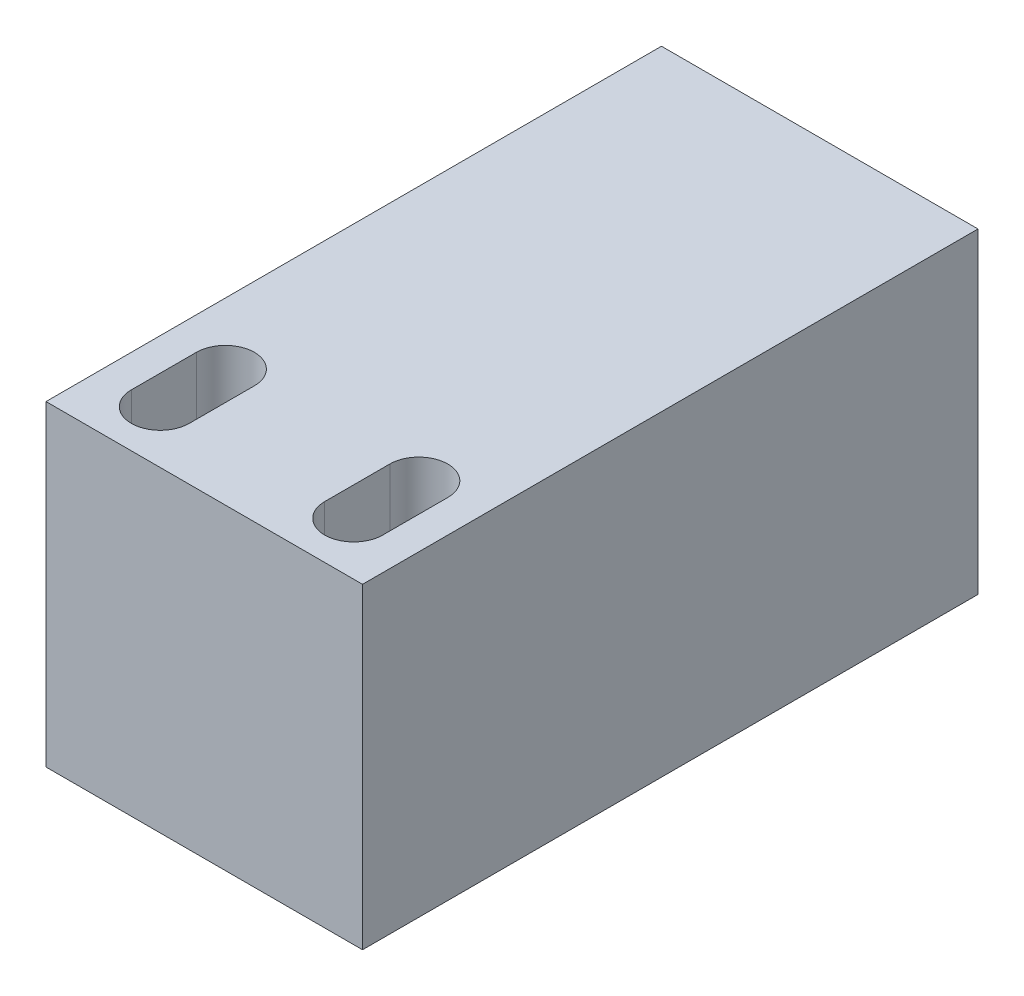
ISO-10303-21;
HEADER;
FILE_DESCRIPTION(('STEP AP214'),'2;1');
FILE_NAME('part.step','',(''),(''),'','','');
FILE_SCHEMA(('AUTOMOTIVE_DESIGN { 1 0 10303 214 1 1 1 1 }'));
ENDSEC;
DATA;
#1=APPLICATION_CONTEXT('core data for automotive mechanical design processes');
#2=APPLICATION_PROTOCOL_DEFINITION('international standard','automotive_design',2000,#1);
#3=PRODUCT_CONTEXT('',#1,'mechanical');
#4=PRODUCT('Part','Part','',(#3));
#5=PRODUCT_RELATED_PRODUCT_CATEGORY('part','',(#4));
#6=PRODUCT_DEFINITION_FORMATION('','',#4);
#7=PRODUCT_DEFINITION_CONTEXT('part definition',#1,'design');
#8=PRODUCT_DEFINITION('design','',#6,#7);
#9=PRODUCT_DEFINITION_SHAPE('','',#8);
#10=(LENGTH_UNIT() NAMED_UNIT(*) SI_UNIT(.MILLI.,.METRE.));
#11=(NAMED_UNIT(*) PLANE_ANGLE_UNIT() SI_UNIT($,.RADIAN.));
#12=(NAMED_UNIT(*) SI_UNIT($,.STERADIAN.) SOLID_ANGLE_UNIT());
#13=UNCERTAINTY_MEASURE_WITH_UNIT(LENGTH_MEASURE(1.E-05),#10,'distance_accuracy_value','');
#14=(GEOMETRIC_REPRESENTATION_CONTEXT(3) GLOBAL_UNCERTAINTY_ASSIGNED_CONTEXT((#13)) GLOBAL_UNIT_ASSIGNED_CONTEXT((#10,
#11,#12)) REPRESENTATION_CONTEXT('',''));
#15=CARTESIAN_POINT('',(0.,0.,0.));
#16=DIRECTION('',(0.,0.,1.));
#17=DIRECTION('',(1.,0.,0.));
#18=AXIS2_PLACEMENT_3D('',#15,#16,#17);
#19=CARTESIAN_POINT('',(9.,9.,35.));
#20=DIRECTION('',(-1.,0.,0.));
#21=DIRECTION('',(0.,0.,1.));
#22=AXIS2_PLACEMENT_3D('',#19,#20,#21);
#23=PLANE('',#22);
#24=DIRECTION('',(0.,1.,0.));
#25=VECTOR('',#24,1.);
#26=CARTESIAN_POINT('',(9.,9.,0.));
#27=LINE('',#26,#25);
#28=CARTESIAN_POINT('',(9.,-9.,0.));
#29=VERTEX_POINT('',#28);
#30=CARTESIAN_POINT('',(9.,9.,0.));
#31=VERTEX_POINT('',#30);
#32=EDGE_CURVE('E162',#29,#31,#27,.T.);
#33=ORIENTED_EDGE('',*,*,#32,.T.);
#34=DIRECTION('',(0.,0.,-1.));
#35=VECTOR('',#34,1.);
#36=CARTESIAN_POINT('',(9.,9.,35.));
#37=LINE('',#36,#35);
#38=CARTESIAN_POINT('',(9.,9.,35.));
#39=VERTEX_POINT('',#38);
#40=EDGE_CURVE('E195',#39,#31,#37,.T.);
#41=ORIENTED_EDGE('',*,*,#40,.F.);
#42=DIRECTION('',(0.,1.,0.));
#43=VECTOR('',#42,1.);
#44=CARTESIAN_POINT('',(9.,9.,35.));
#45=LINE('',#44,#43);
#46=CARTESIAN_POINT('',(9.,-9.,35.));
#47=VERTEX_POINT('',#46);
#48=EDGE_CURVE('E169',#47,#39,#45,.T.);
#49=ORIENTED_EDGE('',*,*,#48,.F.);
#50=DIRECTION('',(0.,0.,-1.));
#51=VECTOR('',#50,1.);
#52=CARTESIAN_POINT('',(9.,-9.,35.));
#53=LINE('',#52,#51);
#54=EDGE_CURVE('E179',#47,#29,#53,.T.);
#55=ORIENTED_EDGE('',*,*,#54,.T.);
#56=EDGE_LOOP('',(#33,#41,#49,#55));
#57=FACE_BOUND('',#56,.T.);
#58=ADVANCED_FACE('F32',(#57),#23,.F.);
#59=CARTESIAN_POINT('',(-9.,9.,35.));
#60=DIRECTION('',(0.,-1.,0.));
#61=DIRECTION('',(0.,0.,-1.));
#62=AXIS2_PLACEMENT_3D('',#59,#60,#61);
#63=PLANE('',#62);
#64=DIRECTION('',(0.,0.,-1.));
#65=VECTOR('',#64,1.);
#66=CARTESIAN_POINT('',(-3.85,9.,32.));
#67=LINE('',#66,#65);
#68=CARTESIAN_POINT('',(-3.85,9.,32.));
#69=VERTEX_POINT('',#68);
#70=CARTESIAN_POINT('',(-3.85,9.,28.3));
#71=VERTEX_POINT('',#70);
#72=EDGE_CURVE('E132',#69,#71,#67,.T.);
#73=ORIENTED_EDGE('',*,*,#72,.F.);
#74=CARTESIAN_POINT('',(-5.5,9.,32.));
#75=DIRECTION('',(0.,1.,0.));
#76=DIRECTION('',(0.,0.,1.));
#77=AXIS2_PLACEMENT_3D('',#74,#75,#76);
#78=CIRCLE('',#77,1.65);
#79=CARTESIAN_POINT('',(-7.15,9.,32.));
#80=VERTEX_POINT('',#79);
#81=EDGE_CURVE('E46',#80,#69,#78,.T.);
#82=ORIENTED_EDGE('',*,*,#81,.F.);
#83=DIRECTION('',(0.,0.,1.));
#84=VECTOR('',#83,1.);
#85=CARTESIAN_POINT('',(-7.15,9.,32.));
#86=LINE('',#85,#84);
#87=CARTESIAN_POINT('',(-7.15,9.,28.3));
#88=VERTEX_POINT('',#87);
#89=EDGE_CURVE('E139',#88,#80,#86,.T.);
#90=ORIENTED_EDGE('',*,*,#89,.F.);
#91=CARTESIAN_POINT('',(-5.5,9.,28.3));
#92=DIRECTION('',(0.,1.,0.));
#93=DIRECTION('',(0.,0.,1.));
#94=AXIS2_PLACEMENT_3D('',#91,#92,#93);
#95=CIRCLE('',#94,1.65);
#96=EDGE_CURVE('E123',#71,#88,#95,.T.);
#97=ORIENTED_EDGE('',*,*,#96,.F.);
#98=EDGE_LOOP('',(#73,#82,#90,#97));
#99=FACE_BOUND('',#98,.T.);
#100=DIRECTION('',(0.,0.,-1.));
#101=VECTOR('',#100,1.);
#102=CARTESIAN_POINT('',(7.15,9.,32.));
#103=LINE('',#102,#101);
#104=CARTESIAN_POINT('',(7.15,9.,32.));
#105=VERTEX_POINT('',#104);
#106=CARTESIAN_POINT('',(7.15,9.,28.3));
#107=VERTEX_POINT('',#106);
#108=EDGE_CURVE('E150',#105,#107,#103,.T.);
#109=ORIENTED_EDGE('',*,*,#108,.F.);
#110=CARTESIAN_POINT('',(5.5,9.,32.));
#111=DIRECTION('',(0.,1.,0.));
#112=DIRECTION('',(0.,0.,1.));
#113=AXIS2_PLACEMENT_3D('',#110,#111,#112);
#114=CIRCLE('',#113,1.65);
#115=CARTESIAN_POINT('',(3.85,9.,32.));
#116=VERTEX_POINT('',#115);
#117=EDGE_CURVE('E146',#116,#105,#114,.T.);
#118=ORIENTED_EDGE('',*,*,#117,.F.);
#119=DIRECTION('',(0.,0.,1.));
#120=VECTOR('',#119,1.);
#121=CARTESIAN_POINT('',(3.85,9.,32.));
#122=LINE('',#121,#120);
#123=CARTESIAN_POINT('',(3.85,9.,28.3));
#124=VERTEX_POINT('',#123);
#125=EDGE_CURVE('E156',#124,#116,#122,.T.);
#126=ORIENTED_EDGE('',*,*,#125,.F.);
#127=CARTESIAN_POINT('',(5.5,9.,28.3));
#128=DIRECTION('',(0.,1.,0.));
#129=DIRECTION('',(0.,0.,1.));
#130=AXIS2_PLACEMENT_3D('',#127,#128,#129);
#131=CIRCLE('',#130,1.65);
#132=EDGE_CURVE('E153',#107,#124,#131,.T.);
#133=ORIENTED_EDGE('',*,*,#132,.F.);
#134=EDGE_LOOP('',(#109,#118,#126,#133));
#135=FACE_BOUND('',#134,.T.);
#136=DIRECTION('',(-1.,0.,0.));
#137=VECTOR('',#136,1.);
#138=CARTESIAN_POINT('',(-9.,9.,0.));
#139=LINE('',#138,#137);
#140=CARTESIAN_POINT('',(-9.,9.,0.));
#141=VERTEX_POINT('',#140);
#142=EDGE_CURVE('E182',#31,#141,#139,.T.);
#143=ORIENTED_EDGE('',*,*,#142,.T.);
#144=DIRECTION('',(0.,0.,-1.));
#145=VECTOR('',#144,1.);
#146=CARTESIAN_POINT('',(-9.,9.,35.));
#147=LINE('',#146,#145);
#148=CARTESIAN_POINT('',(-9.,9.,35.));
#149=VERTEX_POINT('',#148);
#150=EDGE_CURVE('E192',#149,#141,#147,.T.);
#151=ORIENTED_EDGE('',*,*,#150,.F.);
#152=DIRECTION('',(-1.,0.,0.));
#153=VECTOR('',#152,1.);
#154=CARTESIAN_POINT('',(-9.,9.,35.));
#155=LINE('',#154,#153);
#156=EDGE_CURVE('E172',#39,#149,#155,.T.);
#157=ORIENTED_EDGE('',*,*,#156,.F.);
#158=ORIENTED_EDGE('',*,*,#40,.T.);
#159=EDGE_LOOP('',(#143,#151,#157,#158));
#160=FACE_BOUND('',#159,.T.);
#161=ADVANCED_FACE('F136',(#99,#135,#160),#63,.F.);
#162=CARTESIAN_POINT('',(-9.,9.,35.));
#163=DIRECTION('',(1.,0.,0.));
#164=DIRECTION('',(0.,0.,-1.));
#165=AXIS2_PLACEMENT_3D('',#162,#163,#164);
#166=PLANE('',#165);
#167=DIRECTION('',(0.,-1.,0.));
#168=VECTOR('',#167,1.);
#169=CARTESIAN_POINT('',(-9.,9.,0.));
#170=LINE('',#169,#168);
#171=CARTESIAN_POINT('',(-9.,-9.,0.));
#172=VERTEX_POINT('',#171);
#173=EDGE_CURVE('E184',#141,#172,#170,.T.);
#174=ORIENTED_EDGE('',*,*,#173,.T.);
#175=DIRECTION('',(0.,0.,-1.));
#176=VECTOR('',#175,1.);
#177=CARTESIAN_POINT('',(-9.,-9.,35.));
#178=LINE('',#177,#176);
#179=CARTESIAN_POINT('',(-9.,-9.,35.));
#180=VERTEX_POINT('',#179);
#181=EDGE_CURVE('E189',#180,#172,#178,.T.);
#182=ORIENTED_EDGE('',*,*,#181,.F.);
#183=DIRECTION('',(0.,-1.,0.));
#184=VECTOR('',#183,1.);
#185=CARTESIAN_POINT('',(-9.,9.,35.));
#186=LINE('',#185,#184);
#187=EDGE_CURVE('E175',#149,#180,#186,.T.);
#188=ORIENTED_EDGE('',*,*,#187,.F.);
#189=ORIENTED_EDGE('',*,*,#150,.T.);
#190=EDGE_LOOP('',(#174,#182,#188,#189));
#191=FACE_BOUND('',#190,.T.);
#192=ADVANCED_FACE('F238',(#191),#166,.F.);
#193=CARTESIAN_POINT('',(-9.,-9.,35.));
#194=DIRECTION('',(0.,1.,0.));
#195=DIRECTION('',(0.,0.,1.));
#196=AXIS2_PLACEMENT_3D('',#193,#194,#195);
#197=PLANE('',#196);
#198=DIRECTION('',(0.,0.,1.));
#199=VECTOR('',#198,1.);
#200=CARTESIAN_POINT('',(-7.15,-9.,35.));
#201=LINE('',#200,#199);
#202=CARTESIAN_POINT('',(-7.15,-9.,28.3));
#203=VERTEX_POINT('',#202);
#204=CARTESIAN_POINT('',(-7.15,-9.,32.));
#205=VERTEX_POINT('',#204);
#206=EDGE_CURVE('E39',#203,#205,#201,.T.);
#207=ORIENTED_EDGE('',*,*,#206,.T.);
#208=CARTESIAN_POINT('',(-5.5,-9.,32.));
#209=DIRECTION('',(0.,1.,0.));
#210=DIRECTION('',(0.,0.,1.));
#211=AXIS2_PLACEMENT_3D('',#208,#209,#210);
#212=CIRCLE('',#211,1.65);
#213=CARTESIAN_POINT('',(-3.85,-9.,32.));
#214=VERTEX_POINT('',#213);
#215=EDGE_CURVE('E11',#205,#214,#212,.T.);
#216=ORIENTED_EDGE('',*,*,#215,.T.);
#217=DIRECTION('',(0.,0.,-1.));
#218=VECTOR('',#217,1.);
#219=CARTESIAN_POINT('',(-3.85,-9.,35.));
#220=LINE('',#219,#218);
#221=CARTESIAN_POINT('',(-3.85,-9.,28.3));
#222=VERTEX_POINT('',#221);
#223=EDGE_CURVE('E210',#214,#222,#220,.T.);
#224=ORIENTED_EDGE('',*,*,#223,.T.);
#225=CARTESIAN_POINT('',(-5.5,-9.,28.3));
#226=DIRECTION('',(0.,1.,0.));
#227=DIRECTION('',(0.,0.,1.));
#228=AXIS2_PLACEMENT_3D('',#225,#226,#227);
#229=CIRCLE('',#228,1.65);
#230=EDGE_CURVE('E126',#222,#203,#229,.T.);
#231=ORIENTED_EDGE('',*,*,#230,.T.);
#232=EDGE_LOOP('',(#207,#216,#224,#231));
#233=FACE_BOUND('',#232,.T.);
#234=DIRECTION('',(0.,0.,1.));
#235=VECTOR('',#234,1.);
#236=CARTESIAN_POINT('',(3.85,-9.,35.));
#237=LINE('',#236,#235);
#238=CARTESIAN_POINT('',(3.85,-9.,28.3));
#239=VERTEX_POINT('',#238);
#240=CARTESIAN_POINT('',(3.85,-9.,32.));
#241=VERTEX_POINT('',#240);
#242=EDGE_CURVE('E204',#239,#241,#237,.T.);
#243=ORIENTED_EDGE('',*,*,#242,.T.);
#244=CARTESIAN_POINT('',(5.5,-9.,32.));
#245=DIRECTION('',(0.,1.,0.));
#246=DIRECTION('',(0.,0.,1.));
#247=AXIS2_PLACEMENT_3D('',#244,#245,#246);
#248=CIRCLE('',#247,1.65);
#249=CARTESIAN_POINT('',(7.15,-9.,32.));
#250=VERTEX_POINT('',#249);
#251=EDGE_CURVE('E207',#241,#250,#248,.T.);
#252=ORIENTED_EDGE('',*,*,#251,.T.);
#253=DIRECTION('',(0.,0.,-1.));
#254=VECTOR('',#253,1.);
#255=CARTESIAN_POINT('',(7.15,-9.,35.));
#256=LINE('',#255,#254);
#257=CARTESIAN_POINT('',(7.15,-9.,28.3));
#258=VERTEX_POINT('',#257);
#259=EDGE_CURVE('E198',#250,#258,#256,.T.);
#260=ORIENTED_EDGE('',*,*,#259,.T.);
#261=CARTESIAN_POINT('',(5.5,-9.,28.3));
#262=DIRECTION('',(0.,1.,0.));
#263=DIRECTION('',(0.,0.,1.));
#264=AXIS2_PLACEMENT_3D('',#261,#262,#263);
#265=CIRCLE('',#264,1.65);
#266=EDGE_CURVE('E201',#258,#239,#265,.T.);
#267=ORIENTED_EDGE('',*,*,#266,.T.);
#268=EDGE_LOOP('',(#243,#252,#260,#267));
#269=FACE_BOUND('',#268,.T.);
#270=DIRECTION('',(1.,0.,0.));
#271=VECTOR('',#270,1.);
#272=CARTESIAN_POINT('',(-9.,-9.,0.));
#273=LINE('',#272,#271);
#274=EDGE_CURVE('E173',#172,#29,#273,.T.);
#275=ORIENTED_EDGE('',*,*,#274,.T.);
#276=ORIENTED_EDGE('',*,*,#54,.F.);
#277=DIRECTION('',(1.,0.,0.));
#278=VECTOR('',#277,1.);
#279=CARTESIAN_POINT('',(-9.,-9.,35.));
#280=LINE('',#279,#278);
#281=EDGE_CURVE('E177',#180,#47,#280,.T.);
#282=ORIENTED_EDGE('',*,*,#281,.F.);
#283=ORIENTED_EDGE('',*,*,#181,.T.);
#284=EDGE_LOOP('',(#275,#276,#282,#283));
#285=FACE_BOUND('',#284,.T.);
#286=ADVANCED_FACE('F214',(#233,#269,#285),#197,.F.);
#287=CARTESIAN_POINT('',(9.,-9.,35.));
#288=DIRECTION('',(0.,0.,1.));
#289=DIRECTION('',(1.,0.,0.));
#290=AXIS2_PLACEMENT_3D('',#287,#288,#289);
#291=PLANE('',#290);
#292=ORIENTED_EDGE('',*,*,#48,.T.);
#293=ORIENTED_EDGE('',*,*,#156,.T.);
#294=ORIENTED_EDGE('',*,*,#187,.T.);
#295=ORIENTED_EDGE('',*,*,#281,.T.);
#296=EDGE_LOOP('',(#292,#293,#294,#295));
#297=FACE_BOUND('',#296,.T.);
#298=ADVANCED_FACE('F251',(#297),#291,.T.);
#299=CARTESIAN_POINT('',(9.,-9.,0.));
#300=DIRECTION('',(0.,0.,1.));
#301=DIRECTION('',(1.,0.,0.));
#302=AXIS2_PLACEMENT_3D('',#299,#300,#301);
#303=PLANE('',#302);
#304=ORIENTED_EDGE('',*,*,#32,.F.);
#305=ORIENTED_EDGE('',*,*,#274,.F.);
#306=ORIENTED_EDGE('',*,*,#173,.F.);
#307=ORIENTED_EDGE('',*,*,#142,.F.);
#308=EDGE_LOOP('',(#304,#305,#306,#307));
#309=FACE_BOUND('',#308,.T.);
#310=ADVANCED_FACE('F245',(#309),#303,.F.);
#311=CARTESIAN_POINT('',(5.5,-26.,32.));
#312=DIRECTION('',(0.,1.,0.));
#313=DIRECTION('',(0.,0.,1.));
#314=AXIS2_PLACEMENT_3D('',#311,#312,#313);
#315=CYLINDRICAL_SURFACE('',#314,1.65);
#316=DIRECTION('',(0.,1.,0.));
#317=VECTOR('',#316,1.);
#318=CARTESIAN_POINT('',(3.85,-26.,32.));
#319=LINE('',#318,#317);
#320=EDGE_CURVE('E160',#241,#116,#319,.T.);
#321=ORIENTED_EDGE('',*,*,#320,.T.);
#322=ORIENTED_EDGE('',*,*,#117,.T.);
#323=DIRECTION('',(0.,1.,0.));
#324=VECTOR('',#323,1.);
#325=CARTESIAN_POINT('',(7.15,-26.,32.));
#326=LINE('',#325,#324);
#327=EDGE_CURVE('E159',#250,#105,#326,.T.);
#328=ORIENTED_EDGE('',*,*,#327,.F.);
#329=ORIENTED_EDGE('',*,*,#251,.F.);
#330=EDGE_LOOP('',(#321,#322,#328,#329));
#331=FACE_BOUND('',#330,.T.);
#332=ADVANCED_FACE('F265',(#331),#315,.F.);
#333=CARTESIAN_POINT('',(3.85,-26.,32.));
#334=DIRECTION('',(-1.,0.,0.));
#335=DIRECTION('',(0.,0.,1.));
#336=AXIS2_PLACEMENT_3D('',#333,#334,#335);
#337=PLANE('',#336);
#338=DIRECTION('',(0.,1.,0.));
#339=VECTOR('',#338,1.);
#340=CARTESIAN_POINT('',(3.85,-26.,28.3));
#341=LINE('',#340,#339);
#342=EDGE_CURVE('E163',#239,#124,#341,.T.);
#343=ORIENTED_EDGE('',*,*,#342,.T.);
#344=ORIENTED_EDGE('',*,*,#125,.T.);
#345=ORIENTED_EDGE('',*,*,#320,.F.);
#346=ORIENTED_EDGE('',*,*,#242,.F.);
#347=EDGE_LOOP('',(#343,#344,#345,#346));
#348=FACE_BOUND('',#347,.T.);
#349=ADVANCED_FACE('F269',(#348),#337,.F.);
#350=CARTESIAN_POINT('',(5.5,-26.,28.3));
#351=DIRECTION('',(0.,1.,0.));
#352=DIRECTION('',(0.,0.,1.));
#353=AXIS2_PLACEMENT_3D('',#350,#351,#352);
#354=CYLINDRICAL_SURFACE('',#353,1.65);
#355=DIRECTION('',(0.,1.,0.));
#356=VECTOR('',#355,1.);
#357=CARTESIAN_POINT('',(7.15,-26.,28.3));
#358=LINE('',#357,#356);
#359=EDGE_CURVE('E165',#258,#107,#358,.T.);
#360=ORIENTED_EDGE('',*,*,#359,.T.);
#361=ORIENTED_EDGE('',*,*,#132,.T.);
#362=ORIENTED_EDGE('',*,*,#342,.F.);
#363=ORIENTED_EDGE('',*,*,#266,.F.);
#364=EDGE_LOOP('',(#360,#361,#362,#363));
#365=FACE_BOUND('',#364,.T.);
#366=ADVANCED_FACE('F228',(#365),#354,.F.);
#367=CARTESIAN_POINT('',(7.15,-26.,32.));
#368=DIRECTION('',(1.,0.,0.));
#369=DIRECTION('',(0.,0.,-1.));
#370=AXIS2_PLACEMENT_3D('',#367,#368,#369);
#371=PLANE('',#370);
#372=ORIENTED_EDGE('',*,*,#327,.T.);
#373=ORIENTED_EDGE('',*,*,#108,.T.);
#374=ORIENTED_EDGE('',*,*,#359,.F.);
#375=ORIENTED_EDGE('',*,*,#259,.F.);
#376=EDGE_LOOP('',(#372,#373,#374,#375));
#377=FACE_BOUND('',#376,.T.);
#378=ADVANCED_FACE('F221',(#377),#371,.F.);
#379=CARTESIAN_POINT('',(-5.5,-26.,32.));
#380=DIRECTION('',(0.,1.,0.));
#381=DIRECTION('',(0.,0.,1.));
#382=AXIS2_PLACEMENT_3D('',#379,#380,#381);
#383=CYLINDRICAL_SURFACE('',#382,1.65);
#384=DIRECTION('',(0.,1.,0.));
#385=VECTOR('',#384,1.);
#386=CARTESIAN_POINT('',(-7.15,-26.,32.));
#387=LINE('',#386,#385);
#388=EDGE_CURVE('E144',#205,#80,#387,.T.);
#389=ORIENTED_EDGE('',*,*,#388,.T.);
#390=ORIENTED_EDGE('',*,*,#81,.T.);
#391=DIRECTION('',(0.,1.,0.));
#392=VECTOR('',#391,1.);
#393=CARTESIAN_POINT('',(-3.85,-26.,32.));
#394=LINE('',#393,#392);
#395=EDGE_CURVE('E129',#214,#69,#394,.T.);
#396=ORIENTED_EDGE('',*,*,#395,.F.);
#397=ORIENTED_EDGE('',*,*,#215,.F.);
#398=EDGE_LOOP('',(#389,#390,#396,#397));
#399=FACE_BOUND('',#398,.T.);
#400=ADVANCED_FACE('F219',(#399),#383,.F.);
#401=CARTESIAN_POINT('',(-7.15,-26.,32.));
#402=DIRECTION('',(-1.,0.,0.));
#403=DIRECTION('',(0.,0.,1.));
#404=AXIS2_PLACEMENT_3D('',#401,#402,#403);
#405=PLANE('',#404);
#406=DIRECTION('',(0.,1.,0.));
#407=VECTOR('',#406,1.);
#408=CARTESIAN_POINT('',(-7.15,-26.,28.3));
#409=LINE('',#408,#407);
#410=EDGE_CURVE('E128',#203,#88,#409,.T.);
#411=ORIENTED_EDGE('',*,*,#410,.T.);
#412=ORIENTED_EDGE('',*,*,#89,.T.);
#413=ORIENTED_EDGE('',*,*,#388,.F.);
#414=ORIENTED_EDGE('',*,*,#206,.F.);
#415=EDGE_LOOP('',(#411,#412,#413,#414));
#416=FACE_BOUND('',#415,.T.);
#417=ADVANCED_FACE('F218',(#416),#405,.F.);
#418=CARTESIAN_POINT('',(-5.5,-26.,28.3));
#419=DIRECTION('',(0.,1.,0.));
#420=DIRECTION('',(0.,0.,1.));
#421=AXIS2_PLACEMENT_3D('',#418,#419,#420);
#422=CYLINDRICAL_SURFACE('',#421,1.65);
#423=DIRECTION('',(0.,1.,0.));
#424=VECTOR('',#423,1.);
#425=CARTESIAN_POINT('',(-3.85,-26.,28.3));
#426=LINE('',#425,#424);
#427=EDGE_CURVE('E54',#222,#71,#426,.T.);
#428=ORIENTED_EDGE('',*,*,#427,.T.);
#429=ORIENTED_EDGE('',*,*,#96,.T.);
#430=ORIENTED_EDGE('',*,*,#410,.F.);
#431=ORIENTED_EDGE('',*,*,#230,.F.);
#432=EDGE_LOOP('',(#428,#429,#430,#431));
#433=FACE_BOUND('',#432,.T.);
#434=ADVANCED_FACE('F120',(#433),#422,.F.);
#435=CARTESIAN_POINT('',(-3.85,-26.,32.));
#436=DIRECTION('',(1.,0.,0.));
#437=DIRECTION('',(0.,0.,-1.));
#438=AXIS2_PLACEMENT_3D('',#435,#436,#437);
#439=PLANE('',#438);
#440=ORIENTED_EDGE('',*,*,#395,.T.);
#441=ORIENTED_EDGE('',*,*,#72,.T.);
#442=ORIENTED_EDGE('',*,*,#427,.F.);
#443=ORIENTED_EDGE('',*,*,#223,.F.);
#444=EDGE_LOOP('',(#440,#441,#442,#443));
#445=FACE_BOUND('',#444,.T.);
#446=ADVANCED_FACE('F133',(#445),#439,.F.);
#447=CLOSED_SHELL('',(#58,#161,#192,#286,#298,#310,#332,#349,#366,#378,#400,#417,#434,#446));
#448=MANIFOLD_SOLID_BREP('B2',#447);
#449=ADVANCED_BREP_SHAPE_REPRESENTATION('',(#18,#448),#14);
#450=SHAPE_DEFINITION_REPRESENTATION(#9,#449);
ENDSEC;
END-ISO-10303-21;
